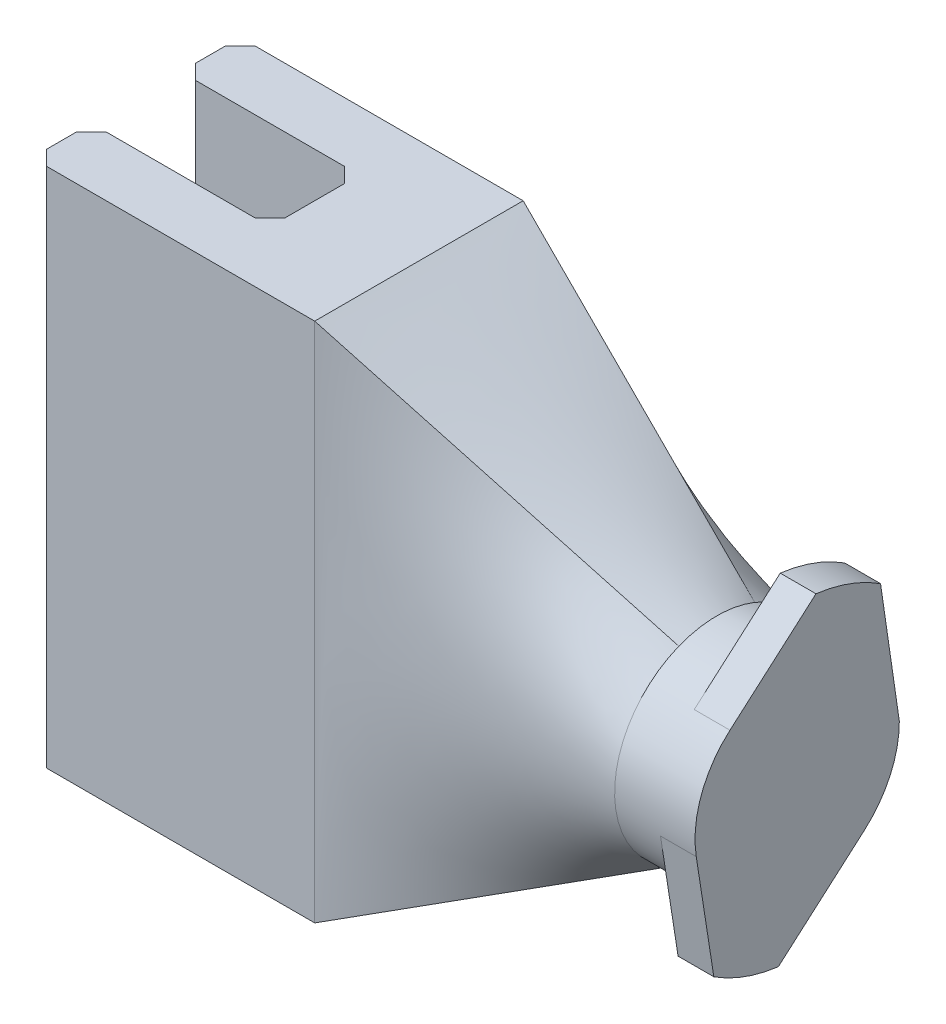
ISO-10303-21;
HEADER;
FILE_DESCRIPTION(('STEP AP214'),'2;1');
FILE_NAME('part.step','',(''),(''),'','','');
FILE_SCHEMA(('AUTOMOTIVE_DESIGN { 1 0 10303 214 1 1 1 1 }'));
ENDSEC;
DATA;
#1=APPLICATION_CONTEXT('core data for automotive mechanical design processes');
#2=APPLICATION_PROTOCOL_DEFINITION('international standard','automotive_design',2000,#1);
#3=PRODUCT_CONTEXT('',#1,'mechanical');
#4=PRODUCT('Part','Part','',(#3));
#5=PRODUCT_RELATED_PRODUCT_CATEGORY('part','',(#4));
#6=PRODUCT_DEFINITION_FORMATION('','',#4);
#7=PRODUCT_DEFINITION_CONTEXT('part definition',#1,'design');
#8=PRODUCT_DEFINITION('design','',#6,#7);
#9=PRODUCT_DEFINITION_SHAPE('','',#8);
#10=(LENGTH_UNIT() NAMED_UNIT(*) SI_UNIT(.MILLI.,.METRE.));
#11=(NAMED_UNIT(*) PLANE_ANGLE_UNIT() SI_UNIT($,.RADIAN.));
#12=(NAMED_UNIT(*) SI_UNIT($,.STERADIAN.) SOLID_ANGLE_UNIT());
#13=UNCERTAINTY_MEASURE_WITH_UNIT(LENGTH_MEASURE(1.E-05),#10,'distance_accuracy_value','');
#14=(GEOMETRIC_REPRESENTATION_CONTEXT(3) GLOBAL_UNCERTAINTY_ASSIGNED_CONTEXT((#13)) GLOBAL_UNIT_ASSIGNED_CONTEXT((#10,
#11,#12)) REPRESENTATION_CONTEXT('',''));
#15=CARTESIAN_POINT('',(0.,0.,0.));
#16=DIRECTION('',(0.,0.,1.));
#17=DIRECTION('',(1.,0.,0.));
#18=AXIS2_PLACEMENT_3D('',#15,#16,#17);
#19=CARTESIAN_POINT('',(32.5,17.5,0.));
#20=DIRECTION('',(1.,0.,0.));
#21=DIRECTION('',(0.,0.,-1.));
#22=AXIS2_PLACEMENT_3D('',#19,#20,#21);
#23=PLANE('',#22);
#24=CARTESIAN_POINT('',(32.5,17.5,0.));
#25=DIRECTION('',(1.,0.,0.));
#26=DIRECTION('',(0.,0.,-1.));
#27=AXIS2_PLACEMENT_3D('',#24,#25,#26);
#28=CIRCLE('',#27,6.86);
#29=CARTESIAN_POINT('',(32.5,17.5,-6.86));
#30=VERTEX_POINT('',#29);
#31=CARTESIAN_POINT('',(32.5,19.4646964731165,-6.57263780901729));
#32=VERTEX_POINT('',#31);
#33=EDGE_CURVE('E372',#30,#32,#28,.T.);
#34=ORIENTED_EDGE('',*,*,#33,.T.);
#35=DIRECTION('',(0.,-0.98947219965666,-0.144723066947228));
#36=VECTOR('',#35,1.);
#37=CARTESIAN_POINT('',(32.5,1.34888164342396,-9.22230930389194));
#38=LINE('',#37,#36);
#39=EDGE_CURVE('E12',#32,#30,#38,.T.);
#40=ORIENTED_EDGE('',*,*,#39,.T.);
#41=EDGE_LOOP('',(#34,#40));
#42=FACE_BOUND('',#41,.T.);
#43=ADVANCED_FACE('F65',(#42),#23,.T.);
#44=CARTESIAN_POINT('',(9.49999999999999,35.,-7.));
#45=DIRECTION('',(0.,0.,1.));
#46=DIRECTION('',(1.,0.,0.));
#47=AXIS2_PLACEMENT_3D('',#44,#45,#46);
#48=PLANE('',#47);
#49=DIRECTION('',(-1.,0.,0.));
#50=VECTOR('',#49,1.);
#51=CARTESIAN_POINT('',(9.49999999999999,0.,-7.));
#52=LINE('',#51,#50);
#53=CARTESIAN_POINT('',(9.5,0.,-7.));
#54=VERTEX_POINT('',#53);
#55=CARTESIAN_POINT('',(-8.5,0.,-7.));
#56=VERTEX_POINT('',#55);
#57=EDGE_CURVE('E309',#54,#56,#52,.T.);
#58=ORIENTED_EDGE('',*,*,#57,.T.);
#59=DIRECTION('',(0.,-1.,0.));
#60=VECTOR('',#59,1.);
#61=CARTESIAN_POINT('',(-8.5,35.,-7.));
#62=LINE('',#61,#60);
#63=CARTESIAN_POINT('',(-8.5,35.,-7.));
#64=VERTEX_POINT('',#63);
#65=EDGE_CURVE('E202',#64,#56,#62,.T.);
#66=ORIENTED_EDGE('',*,*,#65,.F.);
#67=DIRECTION('',(-1.,0.,0.));
#68=VECTOR('',#67,1.);
#69=CARTESIAN_POINT('',(9.49999999999999,35.,-7.));
#70=LINE('',#69,#68);
#71=CARTESIAN_POINT('',(9.5,35.,-7.));
#72=VERTEX_POINT('',#71);
#73=EDGE_CURVE('E199',#72,#64,#70,.T.);
#74=ORIENTED_EDGE('',*,*,#73,.F.);
#75=DIRECTION('',(0.,1.,0.));
#76=VECTOR('',#75,1.);
#77=CARTESIAN_POINT('',(9.49999999999999,35.,-7.));
#78=LINE('',#77,#76);
#79=EDGE_CURVE('E74',#72,#54,#78,.F.);
#80=ORIENTED_EDGE('',*,*,#79,.T.);
#81=EDGE_LOOP('',(#58,#66,#74,#80));
#82=FACE_BOUND('',#81,.T.);
#83=ADVANCED_FACE('F67',(#82),#48,.F.);
#84=CARTESIAN_POINT('',(-8.5,35.,-7.));
#85=DIRECTION('',(0.707106781186546,0.,0.707106781186549));
#86=DIRECTION('',(0.707106781186549,0.,-0.707106781186546));
#87=AXIS2_PLACEMENT_3D('',#84,#85,#86);
#88=PLANE('',#87);
#89=DIRECTION('',(-0.707106781186549,0.,0.707106781186546));
#90=VECTOR('',#89,1.);
#91=CARTESIAN_POINT('',(-8.5,0.,-7.));
#92=LINE('',#91,#90);
#93=CARTESIAN_POINT('',(-9.50000000000001,0.,-6.));
#94=VERTEX_POINT('',#93);
#95=EDGE_CURVE('E306',#56,#94,#92,.T.);
#96=ORIENTED_EDGE('',*,*,#95,.T.);
#97=DIRECTION('',(0.,-1.,0.));
#98=VECTOR('',#97,1.);
#99=CARTESIAN_POINT('',(-9.50000000000001,35.,-6.));
#100=LINE('',#99,#98);
#101=CARTESIAN_POINT('',(-9.50000000000001,35.,-6.));
#102=VERTEX_POINT('',#101);
#103=EDGE_CURVE('E357',#102,#94,#100,.T.);
#104=ORIENTED_EDGE('',*,*,#103,.F.);
#105=DIRECTION('',(-0.707106781186549,0.,0.707106781186546));
#106=VECTOR('',#105,1.);
#107=CARTESIAN_POINT('',(-8.5,35.,-7.));
#108=LINE('',#107,#106);
#109=EDGE_CURVE('E204',#64,#102,#108,.T.);
#110=ORIENTED_EDGE('',*,*,#109,.F.);
#111=ORIENTED_EDGE('',*,*,#65,.T.);
#112=EDGE_LOOP('',(#96,#104,#110,#111));
#113=FACE_BOUND('',#112,.T.);
#114=ADVANCED_FACE('F654',(#113),#88,.F.);
#115=CARTESIAN_POINT('',(-9.50000000000001,35.,-6.));
#116=DIRECTION('',(1.,0.,0.));
#117=DIRECTION('',(0.,0.,-1.));
#118=AXIS2_PLACEMENT_3D('',#115,#116,#117);
#119=PLANE('',#118);
#120=DIRECTION('',(0.,0.,1.));
#121=VECTOR('',#120,1.);
#122=CARTESIAN_POINT('',(-9.50000000000001,0.,-6.));
#123=LINE('',#122,#121);
#124=CARTESIAN_POINT('',(-9.50000000000001,0.,-4.));
#125=VERTEX_POINT('',#124);
#126=EDGE_CURVE('E308',#94,#125,#123,.T.);
#127=ORIENTED_EDGE('',*,*,#126,.T.);
#128=DIRECTION('',(0.,-1.,0.));
#129=VECTOR('',#128,1.);
#130=CARTESIAN_POINT('',(-9.50000000000001,35.,-4.));
#131=LINE('',#130,#129);
#132=CARTESIAN_POINT('',(-9.50000000000001,35.,-4.));
#133=VERTEX_POINT('',#132);
#134=EDGE_CURVE('E354',#133,#125,#131,.T.);
#135=ORIENTED_EDGE('',*,*,#134,.F.);
#136=DIRECTION('',(0.,0.,1.));
#137=VECTOR('',#136,1.);
#138=CARTESIAN_POINT('',(-9.50000000000001,35.,-6.));
#139=LINE('',#138,#137);
#140=EDGE_CURVE('E286',#102,#133,#139,.T.);
#141=ORIENTED_EDGE('',*,*,#140,.F.);
#142=ORIENTED_EDGE('',*,*,#103,.T.);
#143=EDGE_LOOP('',(#127,#135,#141,#142));
#144=FACE_BOUND('',#143,.T.);
#145=ADVANCED_FACE('F650',(#144),#119,.F.);
#146=CARTESIAN_POINT('',(-9.50000000000001,35.,-4.));
#147=DIRECTION('',(0.707106781186548,0.,-0.707106781186547));
#148=DIRECTION('',(-0.707106781186547,0.,-0.707106781186548));
#149=AXIS2_PLACEMENT_3D('',#146,#147,#148);
#150=PLANE('',#149);
#151=DIRECTION('',(0.707106781186547,0.,0.707106781186548));
#152=VECTOR('',#151,1.);
#153=CARTESIAN_POINT('',(-9.50000000000001,0.,-4.));
#154=LINE('',#153,#152);
#155=CARTESIAN_POINT('',(-8.50000000000001,0.,-3.));
#156=VERTEX_POINT('',#155);
#157=EDGE_CURVE('E311',#125,#156,#154,.T.);
#158=ORIENTED_EDGE('',*,*,#157,.T.);
#159=DIRECTION('',(0.,-1.,0.));
#160=VECTOR('',#159,1.);
#161=CARTESIAN_POINT('',(-8.50000000000001,35.,-3.));
#162=LINE('',#161,#160);
#163=CARTESIAN_POINT('',(-8.50000000000001,35.,-3.));
#164=VERTEX_POINT('',#163);
#165=EDGE_CURVE('E351',#164,#156,#162,.T.);
#166=ORIENTED_EDGE('',*,*,#165,.F.);
#167=DIRECTION('',(0.707106781186547,0.,0.707106781186548));
#168=VECTOR('',#167,1.);
#169=CARTESIAN_POINT('',(-9.50000000000001,35.,-4.));
#170=LINE('',#169,#168);
#171=EDGE_CURVE('E288',#133,#164,#170,.T.);
#172=ORIENTED_EDGE('',*,*,#171,.F.);
#173=ORIENTED_EDGE('',*,*,#134,.T.);
#174=EDGE_LOOP('',(#158,#166,#172,#173));
#175=FACE_BOUND('',#174,.T.);
#176=ADVANCED_FACE('F646',(#175),#150,.F.);
#177=CARTESIAN_POINT('',(-8.50000000000001,35.,-3.));
#178=DIRECTION('',(0.,0.,-1.));
#179=DIRECTION('',(-1.,0.,0.));
#180=AXIS2_PLACEMENT_3D('',#177,#178,#179);
#181=PLANE('',#180);
#182=DIRECTION('',(1.,0.,0.));
#183=VECTOR('',#182,1.);
#184=CARTESIAN_POINT('',(-8.50000000000001,0.,-3.));
#185=LINE('',#184,#183);
#186=CARTESIAN_POINT('',(1.49999999999999,0.,-3.));
#187=VERTEX_POINT('',#186);
#188=EDGE_CURVE('E313',#156,#187,#185,.T.);
#189=ORIENTED_EDGE('',*,*,#188,.T.);
#190=DIRECTION('',(0.,-1.,0.));
#191=VECTOR('',#190,1.);
#192=CARTESIAN_POINT('',(1.49999999999999,35.,-3.));
#193=LINE('',#192,#191);
#194=CARTESIAN_POINT('',(1.49999999999999,35.,-3.));
#195=VERTEX_POINT('',#194);
#196=EDGE_CURVE('E348',#195,#187,#193,.T.);
#197=ORIENTED_EDGE('',*,*,#196,.F.);
#198=DIRECTION('',(1.,0.,0.));
#199=VECTOR('',#198,1.);
#200=CARTESIAN_POINT('',(-8.50000000000001,35.,-3.));
#201=LINE('',#200,#199);
#202=EDGE_CURVE('E290',#164,#195,#201,.T.);
#203=ORIENTED_EDGE('',*,*,#202,.F.);
#204=ORIENTED_EDGE('',*,*,#165,.T.);
#205=EDGE_LOOP('',(#189,#197,#203,#204));
#206=FACE_BOUND('',#205,.T.);
#207=ADVANCED_FACE('F641',(#206),#181,.F.);
#208=CARTESIAN_POINT('',(1.49999999999999,35.,-3.));
#209=DIRECTION('',(0.707106781186546,0.,-0.707106781186549));
#210=DIRECTION('',(-0.707106781186549,0.,-0.707106781186546));
#211=AXIS2_PLACEMENT_3D('',#208,#209,#210);
#212=PLANE('',#211);
#213=DIRECTION('',(0.707106781186549,0.,0.707106781186546));
#214=VECTOR('',#213,1.);
#215=CARTESIAN_POINT('',(1.49999999999999,0.,-3.));
#216=LINE('',#215,#214);
#217=CARTESIAN_POINT('',(2.49999999999999,0.,-2.));
#218=VERTEX_POINT('',#217);
#219=EDGE_CURVE('E315',#187,#218,#216,.T.);
#220=ORIENTED_EDGE('',*,*,#219,.T.);
#221=DIRECTION('',(0.,-1.,0.));
#222=VECTOR('',#221,1.);
#223=CARTESIAN_POINT('',(2.49999999999999,35.,-2.));
#224=LINE('',#223,#222);
#225=CARTESIAN_POINT('',(2.49999999999999,35.,-2.));
#226=VERTEX_POINT('',#225);
#227=EDGE_CURVE('E345',#226,#218,#224,.T.);
#228=ORIENTED_EDGE('',*,*,#227,.F.);
#229=DIRECTION('',(0.707106781186549,0.,0.707106781186546));
#230=VECTOR('',#229,1.);
#231=CARTESIAN_POINT('',(1.49999999999999,35.,-3.));
#232=LINE('',#231,#230);
#233=EDGE_CURVE('E292',#195,#226,#232,.T.);
#234=ORIENTED_EDGE('',*,*,#233,.F.);
#235=ORIENTED_EDGE('',*,*,#196,.T.);
#236=EDGE_LOOP('',(#220,#228,#234,#235));
#237=FACE_BOUND('',#236,.T.);
#238=ADVANCED_FACE('F635',(#237),#212,.F.);
#239=CARTESIAN_POINT('',(2.49999999999999,35.,-2.));
#240=DIRECTION('',(1.,0.,0.));
#241=DIRECTION('',(0.,0.,-1.));
#242=AXIS2_PLACEMENT_3D('',#239,#240,#241);
#243=PLANE('',#242);
#244=DIRECTION('',(0.,0.,1.));
#245=VECTOR('',#244,1.);
#246=CARTESIAN_POINT('',(2.49999999999999,0.,-2.));
#247=LINE('',#246,#245);
#248=CARTESIAN_POINT('',(2.49999999999999,0.,2.));
#249=VERTEX_POINT('',#248);
#250=EDGE_CURVE('E317',#218,#249,#247,.T.);
#251=ORIENTED_EDGE('',*,*,#250,.T.);
#252=DIRECTION('',(0.,-1.,0.));
#253=VECTOR('',#252,1.);
#254=CARTESIAN_POINT('',(2.49999999999999,35.,2.));
#255=LINE('',#254,#253);
#256=CARTESIAN_POINT('',(2.49999999999999,35.,2.));
#257=VERTEX_POINT('',#256);
#258=EDGE_CURVE('E342',#257,#249,#255,.T.);
#259=ORIENTED_EDGE('',*,*,#258,.F.);
#260=DIRECTION('',(0.,0.,1.));
#261=VECTOR('',#260,1.);
#262=CARTESIAN_POINT('',(2.49999999999999,35.,-2.));
#263=LINE('',#262,#261);
#264=EDGE_CURVE('E294',#226,#257,#263,.T.);
#265=ORIENTED_EDGE('',*,*,#264,.F.);
#266=ORIENTED_EDGE('',*,*,#227,.T.);
#267=EDGE_LOOP('',(#251,#259,#265,#266));
#268=FACE_BOUND('',#267,.T.);
#269=ADVANCED_FACE('F631',(#268),#243,.F.);
#270=CARTESIAN_POINT('',(2.49999999999999,35.,2.));
#271=DIRECTION('',(0.707106781186549,0.,0.707106781186546));
#272=DIRECTION('',(0.707106781186546,0.,-0.707106781186549));
#273=AXIS2_PLACEMENT_3D('',#270,#271,#272);
#274=PLANE('',#273);
#275=DIRECTION('',(-0.707106781186546,0.,0.707106781186549));
#276=VECTOR('',#275,1.);
#277=CARTESIAN_POINT('',(2.49999999999999,0.,2.));
#278=LINE('',#277,#276);
#279=CARTESIAN_POINT('',(1.5,0.,3.));
#280=VERTEX_POINT('',#279);
#281=EDGE_CURVE('E319',#249,#280,#278,.T.);
#282=ORIENTED_EDGE('',*,*,#281,.T.);
#283=DIRECTION('',(0.,-1.,0.));
#284=VECTOR('',#283,1.);
#285=CARTESIAN_POINT('',(1.5,35.,3.));
#286=LINE('',#285,#284);
#287=CARTESIAN_POINT('',(1.5,35.,3.));
#288=VERTEX_POINT('',#287);
#289=EDGE_CURVE('E339',#288,#280,#286,.T.);
#290=ORIENTED_EDGE('',*,*,#289,.F.);
#291=DIRECTION('',(-0.707106781186546,0.,0.707106781186549));
#292=VECTOR('',#291,1.);
#293=CARTESIAN_POINT('',(2.49999999999999,35.,2.));
#294=LINE('',#293,#292);
#295=EDGE_CURVE('E296',#257,#288,#294,.T.);
#296=ORIENTED_EDGE('',*,*,#295,.F.);
#297=ORIENTED_EDGE('',*,*,#258,.T.);
#298=EDGE_LOOP('',(#282,#290,#296,#297));
#299=FACE_BOUND('',#298,.T.);
#300=ADVANCED_FACE('F626',(#299),#274,.F.);
#301=CARTESIAN_POINT('',(-8.50000000000001,35.,3.));
#302=DIRECTION('',(0.,0.,1.));
#303=DIRECTION('',(1.,0.,0.));
#304=AXIS2_PLACEMENT_3D('',#301,#302,#303);
#305=PLANE('',#304);
#306=DIRECTION('',(-1.,0.,0.));
#307=VECTOR('',#306,1.);
#308=CARTESIAN_POINT('',(-8.50000000000001,0.,3.));
#309=LINE('',#308,#307);
#310=CARTESIAN_POINT('',(-8.50000000000001,0.,3.));
#311=VERTEX_POINT('',#310);
#312=EDGE_CURVE('E321',#280,#311,#309,.T.);
#313=ORIENTED_EDGE('',*,*,#312,.T.);
#314=DIRECTION('',(0.,-1.,0.));
#315=VECTOR('',#314,1.);
#316=CARTESIAN_POINT('',(-8.50000000000001,35.,3.));
#317=LINE('',#316,#315);
#318=CARTESIAN_POINT('',(-8.50000000000001,35.,3.));
#319=VERTEX_POINT('',#318);
#320=EDGE_CURVE('E336',#319,#311,#317,.T.);
#321=ORIENTED_EDGE('',*,*,#320,.F.);
#322=DIRECTION('',(-1.,0.,0.));
#323=VECTOR('',#322,1.);
#324=CARTESIAN_POINT('',(-8.50000000000001,35.,3.));
#325=LINE('',#324,#323);
#326=EDGE_CURVE('E298',#288,#319,#325,.T.);
#327=ORIENTED_EDGE('',*,*,#326,.F.);
#328=ORIENTED_EDGE('',*,*,#289,.T.);
#329=EDGE_LOOP('',(#313,#321,#327,#328));
#330=FACE_BOUND('',#329,.T.);
#331=ADVANCED_FACE('F620',(#330),#305,.F.);
#332=CARTESIAN_POINT('',(-8.50000000000001,35.,3.));
#333=DIRECTION('',(0.707106781186549,0.,0.707106781186546));
#334=DIRECTION('',(0.707106781186546,0.,-0.707106781186549));
#335=AXIS2_PLACEMENT_3D('',#332,#333,#334);
#336=PLANE('',#335);
#337=DIRECTION('',(-0.707106781186546,0.,0.707106781186549));
#338=VECTOR('',#337,1.);
#339=CARTESIAN_POINT('',(-8.50000000000001,0.,3.));
#340=LINE('',#339,#338);
#341=CARTESIAN_POINT('',(-9.50000000000001,0.,4.));
#342=VERTEX_POINT('',#341);
#343=EDGE_CURVE('E323',#311,#342,#340,.T.);
#344=ORIENTED_EDGE('',*,*,#343,.T.);
#345=DIRECTION('',(0.,-1.,0.));
#346=VECTOR('',#345,1.);
#347=CARTESIAN_POINT('',(-9.50000000000001,35.,4.));
#348=LINE('',#347,#346);
#349=CARTESIAN_POINT('',(-9.50000000000001,35.,4.));
#350=VERTEX_POINT('',#349);
#351=EDGE_CURVE('E333',#350,#342,#348,.T.);
#352=ORIENTED_EDGE('',*,*,#351,.F.);
#353=DIRECTION('',(-0.707106781186546,0.,0.707106781186549));
#354=VECTOR('',#353,1.);
#355=CARTESIAN_POINT('',(-8.50000000000001,35.,3.));
#356=LINE('',#355,#354);
#357=EDGE_CURVE('E300',#319,#350,#356,.T.);
#358=ORIENTED_EDGE('',*,*,#357,.F.);
#359=ORIENTED_EDGE('',*,*,#320,.T.);
#360=EDGE_LOOP('',(#344,#352,#358,#359));
#361=FACE_BOUND('',#360,.T.);
#362=ADVANCED_FACE('F618',(#361),#336,.F.);
#363=CARTESIAN_POINT('',(-9.50000000000001,35.,4.));
#364=DIRECTION('',(1.,0.,0.));
#365=DIRECTION('',(0.,0.,-1.));
#366=AXIS2_PLACEMENT_3D('',#363,#364,#365);
#367=PLANE('',#366);
#368=DIRECTION('',(0.,0.,1.));
#369=VECTOR('',#368,1.);
#370=CARTESIAN_POINT('',(-9.50000000000001,0.,4.));
#371=LINE('',#370,#369);
#372=CARTESIAN_POINT('',(-9.5,0.,6.));
#373=VERTEX_POINT('',#372);
#374=EDGE_CURVE('E325',#342,#373,#371,.T.);
#375=ORIENTED_EDGE('',*,*,#374,.T.);
#376=DIRECTION('',(0.,-1.,0.));
#377=VECTOR('',#376,1.);
#378=CARTESIAN_POINT('',(-9.5,35.,6.));
#379=LINE('',#378,#377);
#380=CARTESIAN_POINT('',(-9.5,35.,6.));
#381=VERTEX_POINT('',#380);
#382=EDGE_CURVE('E330',#381,#373,#379,.T.);
#383=ORIENTED_EDGE('',*,*,#382,.F.);
#384=DIRECTION('',(0.,0.,1.));
#385=VECTOR('',#384,1.);
#386=CARTESIAN_POINT('',(-9.50000000000001,35.,4.));
#387=LINE('',#386,#385);
#388=EDGE_CURVE('E302',#350,#381,#387,.T.);
#389=ORIENTED_EDGE('',*,*,#388,.F.);
#390=ORIENTED_EDGE('',*,*,#351,.T.);
#391=EDGE_LOOP('',(#375,#383,#389,#390));
#392=FACE_BOUND('',#391,.T.);
#393=ADVANCED_FACE('F609',(#392),#367,.F.);
#394=CARTESIAN_POINT('',(-8.5,35.,7.));
#395=DIRECTION('',(0.707106781186547,0.,-0.707106781186548));
#396=DIRECTION('',(-0.707106781186548,0.,-0.707106781186547));
#397=AXIS2_PLACEMENT_3D('',#394,#395,#396);
#398=PLANE('',#397);
#399=DIRECTION('',(0.707106781186548,0.,0.707106781186547));
#400=VECTOR('',#399,1.);
#401=CARTESIAN_POINT('',(-8.5,0.,7.));
#402=LINE('',#401,#400);
#403=CARTESIAN_POINT('',(-8.5,0.,7.));
#404=VERTEX_POINT('',#403);
#405=EDGE_CURVE('E193',#373,#404,#402,.T.);
#406=ORIENTED_EDGE('',*,*,#405,.T.);
#407=DIRECTION('',(0.,-1.,0.));
#408=VECTOR('',#407,1.);
#409=CARTESIAN_POINT('',(-8.5,35.,7.));
#410=LINE('',#409,#408);
#411=CARTESIAN_POINT('',(-8.5,35.,7.));
#412=VERTEX_POINT('',#411);
#413=EDGE_CURVE('E328',#412,#404,#410,.T.);
#414=ORIENTED_EDGE('',*,*,#413,.F.);
#415=DIRECTION('',(0.707106781186548,0.,0.707106781186547));
#416=VECTOR('',#415,1.);
#417=CARTESIAN_POINT('',(-8.5,35.,7.));
#418=LINE('',#417,#416);
#419=EDGE_CURVE('E304',#381,#412,#418,.T.);
#420=ORIENTED_EDGE('',*,*,#419,.F.);
#421=ORIENTED_EDGE('',*,*,#382,.T.);
#422=EDGE_LOOP('',(#406,#414,#420,#421));
#423=FACE_BOUND('',#422,.T.);
#424=ADVANCED_FACE('F613',(#423),#398,.F.);
#425=CARTESIAN_POINT('',(9.49999999999999,35.,7.));
#426=DIRECTION('',(0.,0.,-1.));
#427=DIRECTION('',(-1.,0.,0.));
#428=AXIS2_PLACEMENT_3D('',#425,#426,#427);
#429=PLANE('',#428);
#430=DIRECTION('',(1.,0.,0.));
#431=VECTOR('',#430,1.);
#432=CARTESIAN_POINT('',(9.49999999999999,0.,7.));
#433=LINE('',#432,#431);
#434=CARTESIAN_POINT('',(9.5,0.,7.));
#435=VERTEX_POINT('',#434);
#436=EDGE_CURVE('E210',#404,#435,#433,.T.);
#437=ORIENTED_EDGE('',*,*,#436,.T.);
#438=DIRECTION('',(0.,1.,0.));
#439=VECTOR('',#438,1.);
#440=CARTESIAN_POINT('',(9.49999999999999,35.,7.));
#441=LINE('',#440,#439);
#442=CARTESIAN_POINT('',(9.5,35.,7.));
#443=VERTEX_POINT('',#442);
#444=EDGE_CURVE('E331',#443,#435,#441,.F.);
#445=ORIENTED_EDGE('',*,*,#444,.F.);
#446=DIRECTION('',(1.,0.,0.));
#447=VECTOR('',#446,1.);
#448=CARTESIAN_POINT('',(9.49999999999999,35.,7.));
#449=LINE('',#448,#447);
#450=EDGE_CURVE('E90',#412,#443,#449,.T.);
#451=ORIENTED_EDGE('',*,*,#450,.F.);
#452=ORIENTED_EDGE('',*,*,#413,.T.);
#453=EDGE_LOOP('',(#437,#445,#451,#452));
#454=FACE_BOUND('',#453,.T.);
#455=ADVANCED_FACE('F602',(#454),#429,.F.);
#456=CARTESIAN_POINT('',(0.,35.,0.));
#457=DIRECTION('',(0.,1.,0.));
#458=DIRECTION('',(0.,0.,1.));
#459=AXIS2_PLACEMENT_3D('',#456,#457,#458);
#460=PLANE('',#459);
#461=DIRECTION('',(0.,0.,1.));
#462=VECTOR('',#461,1.);
#463=CARTESIAN_POINT('',(9.49999999999999,35.,0.));
#464=LINE('',#463,#462);
#465=EDGE_CURVE('E205',#443,#72,#464,.F.);
#466=ORIENTED_EDGE('',*,*,#465,.T.);
#467=ORIENTED_EDGE('',*,*,#73,.T.);
#468=ORIENTED_EDGE('',*,*,#109,.T.);
#469=ORIENTED_EDGE('',*,*,#140,.T.);
#470=ORIENTED_EDGE('',*,*,#171,.T.);
#471=ORIENTED_EDGE('',*,*,#202,.T.);
#472=ORIENTED_EDGE('',*,*,#233,.T.);
#473=ORIENTED_EDGE('',*,*,#264,.T.);
#474=ORIENTED_EDGE('',*,*,#295,.T.);
#475=ORIENTED_EDGE('',*,*,#326,.T.);
#476=ORIENTED_EDGE('',*,*,#357,.T.);
#477=ORIENTED_EDGE('',*,*,#388,.T.);
#478=ORIENTED_EDGE('',*,*,#419,.T.);
#479=ORIENTED_EDGE('',*,*,#450,.T.);
#480=EDGE_LOOP('',(#466,#467,#468,#469,#470,#471,#472,#473,#474,#475,#476,#477,#478,#479));
#481=FACE_BOUND('',#480,.T.);
#482=ADVANCED_FACE('F208',(#481),#460,.T.);
#483=CARTESIAN_POINT('',(0.,0.,0.));
#484=DIRECTION('',(0.,1.,0.));
#485=DIRECTION('',(0.,0.,1.));
#486=AXIS2_PLACEMENT_3D('',#483,#484,#485);
#487=PLANE('',#486);
#488=DIRECTION('',(0.,0.,1.));
#489=VECTOR('',#488,1.);
#490=CARTESIAN_POINT('',(9.49999999999999,0.,0.));
#491=LINE('',#490,#489);
#492=EDGE_CURVE('E105',#435,#54,#491,.F.);
#493=ORIENTED_EDGE('',*,*,#492,.F.);
#494=ORIENTED_EDGE('',*,*,#436,.F.);
#495=ORIENTED_EDGE('',*,*,#405,.F.);
#496=ORIENTED_EDGE('',*,*,#374,.F.);
#497=ORIENTED_EDGE('',*,*,#343,.F.);
#498=ORIENTED_EDGE('',*,*,#312,.F.);
#499=ORIENTED_EDGE('',*,*,#281,.F.);
#500=ORIENTED_EDGE('',*,*,#250,.F.);
#501=ORIENTED_EDGE('',*,*,#219,.F.);
#502=ORIENTED_EDGE('',*,*,#188,.F.);
#503=ORIENTED_EDGE('',*,*,#157,.F.);
#504=ORIENTED_EDGE('',*,*,#126,.F.);
#505=ORIENTED_EDGE('',*,*,#95,.F.);
#506=ORIENTED_EDGE('',*,*,#57,.F.);
#507=EDGE_LOOP('',(#493,#494,#495,#496,#497,#498,#499,#500,#501,#502,#503,#504,#505,#506));
#508=FACE_BOUND('',#507,.T.);
#509=ADVANCED_FACE('F603',(#508),#487,.F.);
#510=CARTESIAN_POINT('',(29.5,23.8693500994729,2.54774003978915));
#511=CARTESIAN_POINT('',(9.49999999999999,35.,7.));
#512=CARTESIAN_POINT('',(29.5,24.0270512488982,2.15348716622593));
#513=CARTESIAN_POINT('',(9.49999999999999,35.,5.83333333333333));
#514=CARTESIAN_POINT('',(29.5,24.1507001103624,1.73728769928343));
#515=CARTESIAN_POINT('',(9.49999999999999,35.,4.66666666666666));
#516=CARTESIAN_POINT('',(29.5,24.3172136742593,0.880669193027398));
#517=CARTESIAN_POINT('',(9.49999999999999,35.,2.33333333333333));
#518=CARTESIAN_POINT('',(29.5,24.36,0.440371762823782));
#519=CARTESIAN_POINT('',(9.49999999999999,35.,1.16666666666666));
#520=CARTESIAN_POINT('',(29.5,24.36,-0.440371762823784));
#521=CARTESIAN_POINT('',(9.49999999999999,35.,-1.16666666666667));
#522=CARTESIAN_POINT('',(29.5,24.3172136742593,-0.8806691930274));
#523=CARTESIAN_POINT('',(9.49999999999999,35.,-2.33333333333334));
#524=CARTESIAN_POINT('',(29.5,24.1507001103624,-1.73728769928343));
#525=CARTESIAN_POINT('',(9.49999999999999,35.,-4.66666666666667));
#526=CARTESIAN_POINT('',(29.5,24.0270512488982,-2.15348716622593));
#527=CARTESIAN_POINT('',(9.49999999999999,35.,-5.83333333333334));
#528=CARTESIAN_POINT('',(29.5,23.8693500994729,-2.54774003978915));
#529=CARTESIAN_POINT('',(9.49999999999999,35.,-7.));
#530=B_SPLINE_SURFACE_WITH_KNOTS('',3,1,((#510,#511),(#512,#513),(#514,#515),(#516,#517),(#518,
#519),(#520,#521),(#522,#523),(#524,#525),(#526,#527),(#528,#529)),.UNSPECIFIED.,.F.,.F.,.F.,(4,
2,2,2,4),(2,2),(0.,0.25,0.5,0.75,1.),(0.,1.),.UNSPECIFIED.);
#531=CARTESIAN_POINT('',(29.5,17.5,0.));
#532=DIRECTION('',(1.,0.,0.));
#533=DIRECTION('',(0.,0.,-1.));
#534=AXIS2_PLACEMENT_3D('',#531,#532,#533);
#535=CIRCLE('',#534,6.86);
#536=CARTESIAN_POINT('',(29.5,23.8693500994729,-2.54774003978915));
#537=VERTEX_POINT('',#536);
#538=CARTESIAN_POINT('',(29.5,23.8693624543665,2.54774499647389));
#539=VERTEX_POINT('',#538);
#540=EDGE_CURVE('E115',#537,#539,#535,.T.);
#541=DIRECTION('',(-0.857718432850691,0.477348179464491,-0.190939271785796));
#542=VECTOR('',#541,1.);
#543=CARTESIAN_POINT('',(19.5,29.4346750497364,-4.77387001989458));
#544=LINE('',#543,#542);
#545=EDGE_CURVE('E216',#537,#72,#544,.T.);
#546=DIRECTION('',(0.857718432850691,-0.477348179464491,-0.190939271785796));
#547=VECTOR('',#546,1.);
#548=CARTESIAN_POINT('',(19.5,29.4346750497364,4.77387001989458));
#549=LINE('',#548,#547);
#550=EDGE_CURVE('E222',#443,#539,#549,.T.);
#551=ORIENTED_EDGE('',*,*,#540,.F.);
#552=ORIENTED_EDGE('',*,*,#545,.T.);
#553=ORIENTED_EDGE('',*,*,#465,.F.);
#554=ORIENTED_EDGE('',*,*,#550,.T.);
#555=EDGE_LOOP('',(#551,#552,#553,#554));
#556=FACE_BOUND('',#555,.T.);
#557=ADVANCED_FACE('F221',(#556),#530,.T.);
#558=CARTESIAN_POINT('',(29.5,23.8693500994729,-2.54774003978915));
#559=CARTESIAN_POINT('',(9.49999999999999,35.,-7.));
#560=CARTESIAN_POINT('',(29.5,23.6722236626913,-3.04055613174318));
#561=CARTESIAN_POINT('',(9.49999999999999,33.5416666666667,-7.));
#562=CARTESIAN_POINT('',(29.5,23.4017263408276,-3.55076694432046));
#563=CARTESIAN_POINT('',(9.49999999999999,32.0833333333333,-7.));
#564=CARTESIAN_POINT('',(29.5,22.675510731048,-4.54449209127975));
#565=CARTESIAN_POINT('',(9.49999999999999,29.1666666666667,-7.));
#566=CARTESIAN_POINT('',(29.5,22.2186286969006,-5.02756999458953));
#567=CARTESIAN_POINT('',(9.49999999999999,27.7083333333333,-7.));
#568=CARTESIAN_POINT('',(29.5,21.1152553602671,-5.87127290370413));
#569=CARTESIAN_POINT('',(9.49999999999999,24.7916666666667,-7.));
#570=CARTESIAN_POINT('',(29.5,20.4681481699873,-6.23024692808871));
#571=CARTESIAN_POINT('',(9.49999999999999,23.3333333333333,-7.));
#572=CARTESIAN_POINT('',(29.5,19.0469478846367,-6.72553585866405));
#573=CARTESIAN_POINT('',(9.49999999999999,20.4166666666667,-7.));
#574=CARTESIAN_POINT('',(29.5,18.2740743525648,-6.86));
#575=CARTESIAN_POINT('',(9.49999999999999,18.9583333333333,-7.));
#576=CARTESIAN_POINT('',(29.5,16.7259256474352,-6.86));
#577=CARTESIAN_POINT('',(9.49999999999999,16.0416666666667,-7.));
#578=CARTESIAN_POINT('',(29.5,15.9530521153633,-6.72553585866405));
#579=CARTESIAN_POINT('',(9.49999999999999,14.5833333333333,-7.));
#580=CARTESIAN_POINT('',(29.5,14.5318518300127,-6.2302469280887));
#581=CARTESIAN_POINT('',(9.49999999999999,11.6666666666667,-7.));
#582=CARTESIAN_POINT('',(29.5,13.8847446397329,-5.87127290370413));
#583=CARTESIAN_POINT('',(9.49999999999999,10.2083333333333,-7.));
#584=CARTESIAN_POINT('',(29.5,12.7813713030994,-5.02756999458953));
#585=CARTESIAN_POINT('',(9.49999999999999,7.29166666666667,-7.));
#586=CARTESIAN_POINT('',(29.5,12.324489268952,-4.54449209127975));
#587=CARTESIAN_POINT('',(9.49999999999999,5.83333333333334,-7.));
#588=CARTESIAN_POINT('',(29.5,11.5982736591724,-3.55076694432045));
#589=CARTESIAN_POINT('',(9.49999999999999,2.91666666666667,-7.));
#590=CARTESIAN_POINT('',(29.5,11.3277763373087,-3.04055613174317));
#591=CARTESIAN_POINT('',(9.49999999999999,1.45833333333333,-7.));
#592=CARTESIAN_POINT('',(29.5,11.1306499005271,-2.54774003978915));
#593=CARTESIAN_POINT('',(9.49999999999999,0.,-7.));
#594=B_SPLINE_SURFACE_WITH_KNOTS('',3,1,((#558,#559),(#560,#561),(#562,#563),(#564,#565),(#566,
#567),(#568,#569),(#570,#571),(#572,#573),(#574,#575),(#576,#577),(#578,#579),(#580,#581),(#582,
#583),(#584,#585),(#586,#587),(#588,#589),(#590,#591),(#592,#593)),.UNSPECIFIED.,.F.,.F.,.F.,(4,
2,2,2,2,2,2,2,4),(2,2),(0.,0.125,0.25,0.375,0.5,0.625,0.75,0.875,1.),(0.,1.),.UNSPECIFIED.);
#595=CARTESIAN_POINT('',(29.5,11.1306375456351,-2.54774499647322));
#596=VERTEX_POINT('',#595);
#597=EDGE_CURVE('E226',#596,#537,#535,.T.);
#598=DIRECTION('',(-0.857718432850691,-0.477348179464491,-0.190939271785796));
#599=VECTOR('',#598,1.);
#600=CARTESIAN_POINT('',(19.5,5.56532495026356,-4.77387001989458));
#601=LINE('',#600,#599);
#602=EDGE_CURVE('E219',#596,#54,#601,.T.);
#603=ORIENTED_EDGE('',*,*,#597,.F.);
#604=ORIENTED_EDGE('',*,*,#602,.T.);
#605=ORIENTED_EDGE('',*,*,#79,.F.);
#606=ORIENTED_EDGE('',*,*,#545,.F.);
#607=EDGE_LOOP('',(#603,#604,#605,#606));
#608=FACE_BOUND('',#607,.T.);
#609=ADVANCED_FACE('F215',(#608),#594,.T.);
#610=CARTESIAN_POINT('',(29.5,11.1306499005271,2.54774003978915));
#611=CARTESIAN_POINT('',(9.49999999999999,0.,7.));
#612=CARTESIAN_POINT('',(29.5,11.3277763373087,3.04055613174318));
#613=CARTESIAN_POINT('',(9.49999999999999,1.45833333333333,7.));
#614=CARTESIAN_POINT('',(29.5,11.5982736591724,3.55076694432046));
#615=CARTESIAN_POINT('',(9.49999999999999,2.91666666666667,7.));
#616=CARTESIAN_POINT('',(29.5,12.324489268952,4.54449209127975));
#617=CARTESIAN_POINT('',(9.49999999999999,5.83333333333334,7.));
#618=CARTESIAN_POINT('',(29.5,12.7813713030994,5.02756999458953));
#619=CARTESIAN_POINT('',(9.49999999999999,7.29166666666668,7.));
#620=CARTESIAN_POINT('',(29.5,13.8847446397329,5.87127290370413));
#621=CARTESIAN_POINT('',(9.49999999999999,10.2083333333333,7.));
#622=CARTESIAN_POINT('',(29.5,14.5318518300127,6.23024692808871));
#623=CARTESIAN_POINT('',(9.49999999999999,11.6666666666667,7.));
#624=CARTESIAN_POINT('',(29.5,15.9530521153633,6.72553585866405));
#625=CARTESIAN_POINT('',(9.49999999999999,14.5833333333333,7.));
#626=CARTESIAN_POINT('',(29.5,16.7259256474353,6.86));
#627=CARTESIAN_POINT('',(9.49999999999999,16.0416666666667,7.));
#628=CARTESIAN_POINT('',(29.5,18.2740743525648,6.86));
#629=CARTESIAN_POINT('',(9.49999999999999,18.9583333333333,7.));
#630=CARTESIAN_POINT('',(29.5,19.0469478846367,6.72553585866405));
#631=CARTESIAN_POINT('',(9.49999999999999,20.4166666666667,7.));
#632=CARTESIAN_POINT('',(29.5,20.4681481699873,6.2302469280887));
#633=CARTESIAN_POINT('',(9.49999999999999,23.3333333333333,7.));
#634=CARTESIAN_POINT('',(29.5,21.1152553602671,5.87127290370413));
#635=CARTESIAN_POINT('',(9.49999999999999,24.7916666666667,7.));
#636=CARTESIAN_POINT('',(29.5,22.2186286969006,5.02756999458953));
#637=CARTESIAN_POINT('',(9.49999999999999,27.7083333333333,7.));
#638=CARTESIAN_POINT('',(29.5,22.675510731048,4.54449209127974));
#639=CARTESIAN_POINT('',(9.49999999999999,29.1666666666667,7.));
#640=CARTESIAN_POINT('',(29.5,23.4017263408276,3.55076694432046));
#641=CARTESIAN_POINT('',(9.49999999999999,32.0833333333333,7.));
#642=CARTESIAN_POINT('',(29.5,23.6722236626913,3.04055613174317));
#643=CARTESIAN_POINT('',(9.49999999999999,33.5416666666667,7.));
#644=CARTESIAN_POINT('',(29.5,23.8693500994729,2.54774003978915));
#645=CARTESIAN_POINT('',(9.49999999999999,35.,7.));
#646=B_SPLINE_SURFACE_WITH_KNOTS('',3,1,((#610,#611),(#612,#613),(#614,#615),(#616,#617),(#618,
#619),(#620,#621),(#622,#623),(#624,#625),(#626,#627),(#628,#629),(#630,#631),(#632,#633),(#634,
#635),(#636,#637),(#638,#639),(#640,#641),(#642,#643),(#644,#645)),.UNSPECIFIED.,.F.,.F.,.F.,(4,
2,2,2,2,2,2,2,4),(2,2),(0.,0.125,0.25,0.375000000000001,0.5,0.625,0.75,0.875,1.),(0.,1.),.UNSPECIFIED.);
#647=CARTESIAN_POINT('',(29.5,11.1306499005271,2.54774003978915));
#648=VERTEX_POINT('',#647);
#649=EDGE_CURVE('E371',#539,#648,#535,.T.);
#650=DIRECTION('',(-0.857718432850691,-0.477348179464491,0.190939271785796));
#651=VECTOR('',#650,1.);
#652=CARTESIAN_POINT('',(19.5,5.56532495026356,4.77387001989458));
#653=LINE('',#652,#651);
#654=EDGE_CURVE('E224',#648,#435,#653,.T.);
#655=ORIENTED_EDGE('',*,*,#649,.F.);
#656=ORIENTED_EDGE('',*,*,#550,.F.);
#657=ORIENTED_EDGE('',*,*,#444,.T.);
#658=ORIENTED_EDGE('',*,*,#654,.F.);
#659=EDGE_LOOP('',(#655,#656,#657,#658));
#660=FACE_BOUND('',#659,.T.);
#661=ADVANCED_FACE('F251',(#660),#646,.T.);
#662=CARTESIAN_POINT('',(29.5,11.1306499005271,-2.54774003978915));
#663=CARTESIAN_POINT('',(9.49999999999999,0.,-7.));
#664=CARTESIAN_POINT('',(29.5,10.9729487511018,-2.15348716622593));
#665=CARTESIAN_POINT('',(9.49999999999999,0.,-5.83333333333333));
#666=CARTESIAN_POINT('',(29.5,10.8492998896376,-1.73728769928343));
#667=CARTESIAN_POINT('',(9.49999999999999,0.,-4.66666666666667));
#668=CARTESIAN_POINT('',(29.5,10.6827863257407,-0.880669193027399));
#669=CARTESIAN_POINT('',(9.49999999999999,0.,-2.33333333333333));
#670=CARTESIAN_POINT('',(29.5,10.64,-0.440371762823782));
#671=CARTESIAN_POINT('',(9.49999999999999,0.,-1.16666666666667));
#672=CARTESIAN_POINT('',(29.5,10.64,0.440371762823783));
#673=CARTESIAN_POINT('',(9.49999999999999,0.,1.16666666666667));
#674=CARTESIAN_POINT('',(29.5,10.6827863257407,0.8806691930274));
#675=CARTESIAN_POINT('',(9.49999999999999,0.,2.33333333333333));
#676=CARTESIAN_POINT('',(29.5,10.8492998896376,1.73728769928343));
#677=CARTESIAN_POINT('',(9.49999999999999,0.,4.66666666666667));
#678=CARTESIAN_POINT('',(29.5,10.9729487511018,2.15348716622593));
#679=CARTESIAN_POINT('',(9.49999999999999,0.,5.83333333333333));
#680=CARTESIAN_POINT('',(29.5,11.1306499005271,2.54774003978915));
#681=CARTESIAN_POINT('',(9.49999999999999,0.,7.));
#682=B_SPLINE_SURFACE_WITH_KNOTS('',3,1,((#662,#663),(#664,#665),(#666,#667),(#668,#669),(#670,
#671),(#672,#673),(#674,#675),(#676,#677),(#678,#679),(#680,#681)),.UNSPECIFIED.,.F.,.F.,.F.,(4,
2,2,2,4),(2,2),(0.,0.25,0.5,0.75,1.),(0.,1.),.UNSPECIFIED.);
#683=EDGE_CURVE('E367',#648,#596,#535,.T.);
#684=ORIENTED_EDGE('',*,*,#683,.F.);
#685=ORIENTED_EDGE('',*,*,#654,.T.);
#686=ORIENTED_EDGE('',*,*,#492,.T.);
#687=ORIENTED_EDGE('',*,*,#602,.F.);
#688=EDGE_LOOP('',(#684,#685,#686,#687));
#689=FACE_BOUND('',#688,.T.);
#690=ADVANCED_FACE('F266',(#689),#682,.T.);
#691=CARTESIAN_POINT('',(32.5,17.5,0.));
#692=DIRECTION('',(-1.,0.,0.));
#693=DIRECTION('',(0.,0.,1.));
#694=AXIS2_PLACEMENT_3D('',#691,#692,#693);
#695=CYLINDRICAL_SURFACE('',#694,6.86);
#696=ORIENTED_EDGE('',*,*,#33,.F.);
#697=DIRECTION('',(-1.,0.,0.));
#698=VECTOR('',#697,1.);
#699=CARTESIAN_POINT('',(34.9,17.5,-6.86));
#700=LINE('',#699,#698);
#701=CARTESIAN_POINT('',(34.9,17.5,-6.86));
#702=VERTEX_POINT('',#701);
#703=EDGE_CURVE('E82',#702,#30,#700,.T.);
#704=ORIENTED_EDGE('',*,*,#703,.F.);
#705=CARTESIAN_POINT('',(34.9,17.5,0.));
#706=DIRECTION('',(1.,0.,0.));
#707=DIRECTION('',(0.,0.,-1.));
#708=AXIS2_PLACEMENT_3D('',#705,#706,#707);
#709=CIRCLE('',#708,6.86);
#710=CARTESIAN_POINT('',(34.9,12.333821662721,-4.51333594887743));
#711=VERTEX_POINT('',#710);
#712=EDGE_CURVE('E496',#711,#702,#709,.T.);
#713=ORIENTED_EDGE('',*,*,#712,.F.);
#714=DIRECTION('',(-1.,0.,0.));
#715=VECTOR('',#714,1.);
#716=CARTESIAN_POINT('',(34.9,12.333821662721,-4.51333594887743));
#717=LINE('',#716,#715);
#718=CARTESIAN_POINT('',(32.5,12.333821662721,-4.51333594887743));
#719=VERTEX_POINT('',#718);
#720=EDGE_CURVE('E420',#711,#719,#717,.T.);
#721=ORIENTED_EDGE('',*,*,#720,.T.);
#722=CARTESIAN_POINT('',(32.5,16.4435942188571,6.77817134820062));
#723=VERTEX_POINT('',#722);
#724=EDGE_CURVE('E394',#723,#719,#28,.T.);
#725=ORIENTED_EDGE('',*,*,#724,.F.);
#726=DIRECTION('',(-1.,0.,0.));
#727=VECTOR('',#726,1.);
#728=CARTESIAN_POINT('',(34.9,16.4435942188571,6.77817134820062));
#729=LINE('',#728,#727);
#730=CARTESIAN_POINT('',(34.9,16.4435942188571,6.77817134820062));
#731=VERTEX_POINT('',#730);
#732=EDGE_CURVE('E423',#731,#723,#729,.T.);
#733=ORIENTED_EDGE('',*,*,#732,.F.);
#734=CARTESIAN_POINT('',(34.9,22.666178337279,4.51333594887743));
#735=VERTEX_POINT('',#734);
#736=EDGE_CURVE('E507',#735,#731,#709,.T.);
#737=ORIENTED_EDGE('',*,*,#736,.F.);
#738=DIRECTION('',(-1.,0.,0.));
#739=VECTOR('',#738,1.);
#740=CARTESIAN_POINT('',(34.9,22.666178337279,4.51333594887743));
#741=LINE('',#740,#739);
#742=CARTESIAN_POINT('',(32.5,22.666178337279,4.51333594887743));
#743=VERTEX_POINT('',#742);
#744=EDGE_CURVE('E427',#735,#743,#741,.T.);
#745=ORIENTED_EDGE('',*,*,#744,.T.);
#746=EDGE_CURVE('E388',#32,#743,#28,.T.);
#747=ORIENTED_EDGE('',*,*,#746,.F.);
#748=EDGE_LOOP('',(#696,#704,#713,#721,#725,#733,#737,#745,#747));
#749=FACE_BOUND('',#748,.T.);
#750=ORIENTED_EDGE('',*,*,#540,.T.);
#751=ORIENTED_EDGE('',*,*,#649,.T.);
#752=ORIENTED_EDGE('',*,*,#683,.T.);
#753=ORIENTED_EDGE('',*,*,#597,.T.);
#754=EDGE_LOOP('',(#750,#751,#752,#753));
#755=FACE_BOUND('',#754,.T.);
#756=ADVANCED_FACE('F437',(#749,#755),#695,.T.);
#757=CARTESIAN_POINT('',(32.5,0.,0.));
#758=DIRECTION('',(1.,0.,0.));
#759=DIRECTION('',(0.,0.,-1.));
#760=AXIS2_PLACEMENT_3D('',#757,#758,#759);
#761=PLANE('',#760);
#762=CARTESIAN_POINT('',(32.5,26.1346317300019,-5.59707377897091));
#763=VERTEX_POINT('',#762);
#764=EDGE_CURVE('E400',#763,#32,#38,.T.);
#765=ORIENTED_EDGE('',*,*,#764,.T.);
#766=ORIENTED_EDGE('',*,*,#746,.T.);
#767=DIRECTION('',(0.,-0.657920692256185,0.753087221177695));
#768=VECTOR('',#767,1.);
#769=CARTESIAN_POINT('',(32.5,15.091134684549,13.1840901018915));
#770=LINE('',#769,#768);
#771=CARTESIAN_POINT('',(32.5,27.7122413307707,-1.2626270241439));
#772=VERTEX_POINT('',#771);
#773=EDGE_CURVE('E410',#772,#743,#770,.T.);
#774=ORIENTED_EDGE('',*,*,#773,.F.);
#775=CARTESIAN_POINT('',(32.5,17.5,0.));
#776=DIRECTION('',(1.,0.,0.));
#777=DIRECTION('',(0.,0.,-1.));
#778=AXIS2_PLACEMENT_3D('',#775,#776,#777);
#779=CIRCLE('',#778,10.29);
#780=EDGE_CURVE('E405',#763,#772,#779,.T.);
#781=ORIENTED_EDGE('',*,*,#780,.F.);
#782=EDGE_LOOP('',(#765,#766,#774,#781));
#783=FACE_BOUND('',#782,.T.);
#784=ADVANCED_FACE('F446',(#783),#761,.F.);
#785=DIRECTION('',(0.,0.988071625102131,0.153995011828419));
#786=VECTOR('',#785,1.);
#787=CARTESIAN_POINT('',(32.5,-0.641402666952343,4.11540457028939));
#788=LINE('',#787,#786);
#789=CARTESIAN_POINT('',(32.5,8.86536826999807,5.59707377897092));
#790=VERTEX_POINT('',#789);
#791=EDGE_CURVE('E415',#790,#723,#788,.T.);
#792=ORIENTED_EDGE('',*,*,#791,.T.);
#793=ORIENTED_EDGE('',*,*,#724,.T.);
#794=DIRECTION('',(0.,0.657920692256185,-0.753087221177695));
#795=VECTOR('',#794,1.);
#796=CARTESIAN_POINT('',(32.5,4.75877800999101,4.1574182041366));
#797=LINE('',#796,#795);
#798=CARTESIAN_POINT('',(32.5,7.28775866922929,1.2626270241439));
#799=VERTEX_POINT('',#798);
#800=EDGE_CURVE('E414',#799,#719,#797,.T.);
#801=ORIENTED_EDGE('',*,*,#800,.F.);
#802=CARTESIAN_POINT('',(32.5,17.5,0.));
#803=DIRECTION('',(1.,0.,0.));
#804=DIRECTION('',(0.,0.,-1.));
#805=AXIS2_PLACEMENT_3D('',#802,#803,#804);
#806=CIRCLE('',#805,10.29);
#807=EDGE_CURVE('E411',#790,#799,#806,.T.);
#808=ORIENTED_EDGE('',*,*,#807,.F.);
#809=EDGE_LOOP('',(#792,#793,#801,#808));
#810=FACE_BOUND('',#809,.T.);
#811=ADVANCED_FACE('F455',(#810),#761,.F.);
#812=CARTESIAN_POINT('',(34.9,1.34888164342396,-9.22230930389194));
#813=DIRECTION('',(0.,0.144723066947228,-0.989472199656659));
#814=DIRECTION('',(0.,0.98947219965666,0.144723066947228));
#815=AXIS2_PLACEMENT_3D('',#812,#813,#814);
#816=PLANE('',#815);
#817=ORIENTED_EDGE('',*,*,#764,.F.);
#818=DIRECTION('',(-1.,0.,0.));
#819=VECTOR('',#818,1.);
#820=CARTESIAN_POINT('',(34.9,26.1346317300019,-5.59707377897091));
#821=LINE('',#820,#819);
#822=CARTESIAN_POINT('',(34.9,26.1346317300019,-5.59707377897091));
#823=VERTEX_POINT('',#822);
#824=EDGE_CURVE('E396',#823,#763,#821,.T.);
#825=ORIENTED_EDGE('',*,*,#824,.F.);
#826=DIRECTION('',(0.,-0.98947219965666,-0.144723066947228));
#827=VECTOR('',#826,1.);
#828=CARTESIAN_POINT('',(34.9,1.34888164342396,-9.22230930389194));
#829=LINE('',#828,#827);
#830=EDGE_CURVE('E487',#823,#702,#829,.T.);
#831=ORIENTED_EDGE('',*,*,#830,.T.);
#832=ORIENTED_EDGE('',*,*,#703,.T.);
#833=ORIENTED_EDGE('',*,*,#39,.F.);
#834=EDGE_LOOP('',(#817,#825,#831,#832,#833));
#835=FACE_BOUND('',#834,.T.);
#836=ADVANCED_FACE('F451',(#835),#816,.T.);
#837=CARTESIAN_POINT('',(34.9,17.5,0.));
#838=DIRECTION('',(-1.,0.,0.));
#839=DIRECTION('',(0.,0.,1.));
#840=AXIS2_PLACEMENT_3D('',#837,#838,#839);
#841=CYLINDRICAL_SURFACE('',#840,10.29);
#842=ORIENTED_EDGE('',*,*,#780,.T.);
#843=DIRECTION('',(-1.,0.,0.));
#844=VECTOR('',#843,1.);
#845=CARTESIAN_POINT('',(34.9,27.7122413307707,-1.2626270241439));
#846=LINE('',#845,#844);
#847=CARTESIAN_POINT('',(34.9,27.7122413307707,-1.2626270241439));
#848=VERTEX_POINT('',#847);
#849=EDGE_CURVE('E424',#848,#772,#846,.T.);
#850=ORIENTED_EDGE('',*,*,#849,.F.);
#851=CARTESIAN_POINT('',(34.9,17.5,0.));
#852=DIRECTION('',(1.,0.,0.));
#853=DIRECTION('',(0.,0.,-1.));
#854=AXIS2_PLACEMENT_3D('',#851,#852,#853);
#855=CIRCLE('',#854,10.29);
#856=EDGE_CURVE('E491',#823,#848,#855,.T.);
#857=ORIENTED_EDGE('',*,*,#856,.F.);
#858=ORIENTED_EDGE('',*,*,#824,.T.);
#859=EDGE_LOOP('',(#842,#850,#857,#858));
#860=FACE_BOUND('',#859,.T.);
#861=ADVANCED_FACE('F454',(#860),#841,.T.);
#862=CARTESIAN_POINT('',(34.9,15.091134684549,13.1840901018915));
#863=DIRECTION('',(0.,-0.753087221177695,-0.657920692256185));
#864=DIRECTION('',(0.,0.657920692256185,-0.753087221177695));
#865=AXIS2_PLACEMENT_3D('',#862,#863,#864);
#866=PLANE('',#865);
#867=ORIENTED_EDGE('',*,*,#773,.T.);
#868=ORIENTED_EDGE('',*,*,#744,.F.);
#869=DIRECTION('',(0.,-0.657920692256185,0.753087221177695));
#870=VECTOR('',#869,1.);
#871=CARTESIAN_POINT('',(34.9,15.091134684549,13.1840901018915));
#872=LINE('',#871,#870);
#873=EDGE_CURVE('E501',#848,#735,#872,.T.);
#874=ORIENTED_EDGE('',*,*,#873,.F.);
#875=ORIENTED_EDGE('',*,*,#849,.T.);
#876=EDGE_LOOP('',(#867,#868,#874,#875));
#877=FACE_BOUND('',#876,.T.);
#878=ADVANCED_FACE('F458',(#877),#866,.F.);
#879=CARTESIAN_POINT('',(34.9,-0.641402666952343,4.11540457028939));
#880=DIRECTION('',(0.,-0.153995011828419,0.98807162510213));
#881=DIRECTION('',(0.,-0.988071625102131,-0.153995011828419));
#882=AXIS2_PLACEMENT_3D('',#879,#880,#881);
#883=PLANE('',#882);
#884=ORIENTED_EDGE('',*,*,#791,.F.);
#885=DIRECTION('',(-1.,0.,0.));
#886=VECTOR('',#885,1.);
#887=CARTESIAN_POINT('',(34.9,8.86536826999807,5.59707377897092));
#888=LINE('',#887,#886);
#889=CARTESIAN_POINT('',(34.9,8.86536826999807,5.59707377897092));
#890=VERTEX_POINT('',#889);
#891=EDGE_CURVE('E419',#890,#790,#888,.T.);
#892=ORIENTED_EDGE('',*,*,#891,.F.);
#893=DIRECTION('',(0.,0.988071625102131,0.153995011828419));
#894=VECTOR('',#893,1.);
#895=CARTESIAN_POINT('',(34.9,-0.641402666952343,4.11540457028939));
#896=LINE('',#895,#894);
#897=EDGE_CURVE('E510',#890,#731,#896,.T.);
#898=ORIENTED_EDGE('',*,*,#897,.T.);
#899=ORIENTED_EDGE('',*,*,#732,.T.);
#900=EDGE_LOOP('',(#884,#892,#898,#899));
#901=FACE_BOUND('',#900,.T.);
#902=ADVANCED_FACE('F462',(#901),#883,.T.);
#903=CARTESIAN_POINT('',(34.9,17.5,0.));
#904=DIRECTION('',(-1.,0.,0.));
#905=DIRECTION('',(0.,0.,1.));
#906=AXIS2_PLACEMENT_3D('',#903,#904,#905);
#907=CYLINDRICAL_SURFACE('',#906,10.29);
#908=ORIENTED_EDGE('',*,*,#807,.T.);
#909=DIRECTION('',(-1.,0.,0.));
#910=VECTOR('',#909,1.);
#911=CARTESIAN_POINT('',(34.9,7.28775866922929,1.2626270241439));
#912=LINE('',#911,#910);
#913=CARTESIAN_POINT('',(34.9,7.28775866922929,1.2626270241439));
#914=VERTEX_POINT('',#913);
#915=EDGE_CURVE('E416',#914,#799,#912,.T.);
#916=ORIENTED_EDGE('',*,*,#915,.F.);
#917=CARTESIAN_POINT('',(34.9,17.5,0.));
#918=DIRECTION('',(1.,0.,0.));
#919=DIRECTION('',(0.,0.,-1.));
#920=AXIS2_PLACEMENT_3D('',#917,#918,#919);
#921=CIRCLE('',#920,10.29);
#922=EDGE_CURVE('E512',#890,#914,#921,.T.);
#923=ORIENTED_EDGE('',*,*,#922,.F.);
#924=ORIENTED_EDGE('',*,*,#891,.T.);
#925=EDGE_LOOP('',(#908,#916,#923,#924));
#926=FACE_BOUND('',#925,.T.);
#927=ADVANCED_FACE('F466',(#926),#907,.T.);
#928=CARTESIAN_POINT('',(34.9,4.75877800999101,4.1574182041366));
#929=DIRECTION('',(0.,0.753087221177695,0.657920692256185));
#930=DIRECTION('',(0.,-0.657920692256185,0.753087221177695));
#931=AXIS2_PLACEMENT_3D('',#928,#929,#930);
#932=PLANE('',#931);
#933=ORIENTED_EDGE('',*,*,#800,.T.);
#934=ORIENTED_EDGE('',*,*,#720,.F.);
#935=DIRECTION('',(0.,0.657920692256185,-0.753087221177695));
#936=VECTOR('',#935,1.);
#937=CARTESIAN_POINT('',(34.9,4.75877800999101,4.1574182041366));
#938=LINE('',#937,#936);
#939=EDGE_CURVE('E406',#914,#711,#938,.T.);
#940=ORIENTED_EDGE('',*,*,#939,.F.);
#941=ORIENTED_EDGE('',*,*,#915,.T.);
#942=EDGE_LOOP('',(#933,#934,#940,#941));
#943=FACE_BOUND('',#942,.T.);
#944=ADVANCED_FACE('F470',(#943),#932,.F.);
#945=CARTESIAN_POINT('',(34.9,0.,0.));
#946=DIRECTION('',(1.,0.,0.));
#947=DIRECTION('',(0.,0.,-1.));
#948=AXIS2_PLACEMENT_3D('',#945,#946,#947);
#949=PLANE('',#948);
#950=ORIENTED_EDGE('',*,*,#830,.F.);
#951=ORIENTED_EDGE('',*,*,#856,.T.);
#952=ORIENTED_EDGE('',*,*,#873,.T.);
#953=ORIENTED_EDGE('',*,*,#736,.T.);
#954=ORIENTED_EDGE('',*,*,#897,.F.);
#955=ORIENTED_EDGE('',*,*,#922,.T.);
#956=ORIENTED_EDGE('',*,*,#939,.T.);
#957=ORIENTED_EDGE('',*,*,#712,.T.);
#958=EDGE_LOOP('',(#950,#951,#952,#953,#954,#955,#956,#957));
#959=FACE_BOUND('',#958,.T.);
#960=ADVANCED_FACE('F474',(#959),#949,.T.);
#961=CLOSED_SHELL('',(#43,#83,#114,#145,#176,#207,#238,#269,#300,#331,#362,#393,#424,#455,#482,
#509,#557,#609,#661,#690,#756,#784,#811,#836,#861,#878,#902,#927,#944,#960));
#962=MANIFOLD_SOLID_BREP('B2',#961);
#963=ADVANCED_BREP_SHAPE_REPRESENTATION('',(#18,#962),#14);
#964=SHAPE_DEFINITION_REPRESENTATION(#9,#963);
ENDSEC;
END-ISO-10303-21;
